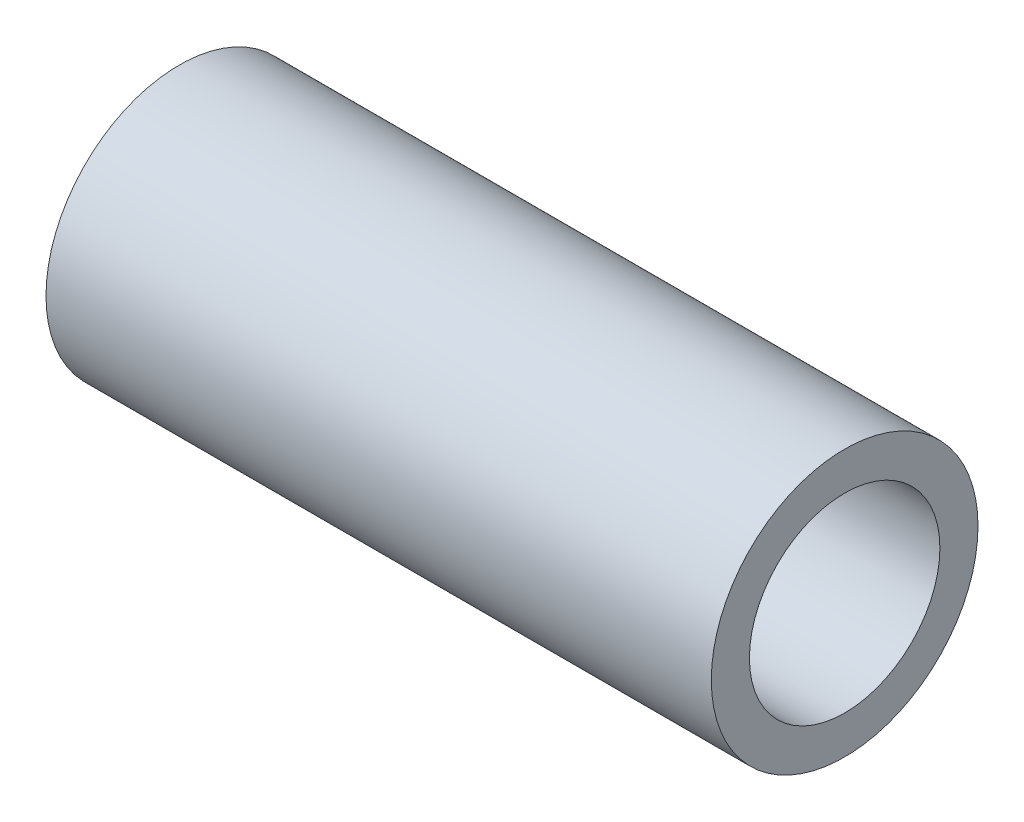
ISO-10303-21;
HEADER;
FILE_DESCRIPTION(('STEP AP214'),'2;1');
FILE_NAME('part.step','',(''),(''),'','','');
FILE_SCHEMA(('AUTOMOTIVE_DESIGN { 1 0 10303 214 1 1 1 1 }'));
ENDSEC;
DATA;
#1=APPLICATION_CONTEXT('core data for automotive mechanical design processes');
#2=APPLICATION_PROTOCOL_DEFINITION('international standard','automotive_design',2000,#1);
#3=PRODUCT_CONTEXT('',#1,'mechanical');
#4=PRODUCT('Part','Part','',(#3));
#5=PRODUCT_RELATED_PRODUCT_CATEGORY('part','',(#4));
#6=PRODUCT_DEFINITION_FORMATION('','',#4);
#7=PRODUCT_DEFINITION_CONTEXT('part definition',#1,'design');
#8=PRODUCT_DEFINITION('design','',#6,#7);
#9=PRODUCT_DEFINITION_SHAPE('','',#8);
#10=(LENGTH_UNIT() NAMED_UNIT(*) SI_UNIT(.MILLI.,.METRE.));
#11=(NAMED_UNIT(*) PLANE_ANGLE_UNIT() SI_UNIT($,.RADIAN.));
#12=(NAMED_UNIT(*) SI_UNIT($,.STERADIAN.) SOLID_ANGLE_UNIT());
#13=UNCERTAINTY_MEASURE_WITH_UNIT(LENGTH_MEASURE(1.E-05),#10,'distance_accuracy_value','');
#14=(GEOMETRIC_REPRESENTATION_CONTEXT(3) GLOBAL_UNCERTAINTY_ASSIGNED_CONTEXT((#13)) GLOBAL_UNIT_ASSIGNED_CONTEXT((#10,
#11,#12)) REPRESENTATION_CONTEXT('',''));
#15=CARTESIAN_POINT('',(0.,0.,0.));
#16=DIRECTION('',(0.,0.,1.));
#17=DIRECTION('',(1.,0.,0.));
#18=AXIS2_PLACEMENT_3D('',#15,#16,#17);
#19=CARTESIAN_POINT('',(17.4625,0.,0.));
#20=DIRECTION('',(1.,0.,0.));
#21=DIRECTION('',(0.,0.,-1.));
#22=AXIS2_PLACEMENT_3D('',#19,#20,#21);
#23=PLANE('',#22);
#24=CARTESIAN_POINT('',(17.4625,0.,0.));
#25=DIRECTION('',(1.,0.,0.));
#26=DIRECTION('',(0.,0.,-1.));
#27=AXIS2_PLACEMENT_3D('',#24,#25,#26);
#28=CIRCLE('',#27,3.5);
#29=CARTESIAN_POINT('',(17.4625,0.,-3.5));
#30=VERTEX_POINT('',#29);
#31=EDGE_CURVE('E10',#30,#30,#28,.T.);
#32=ORIENTED_EDGE('',*,*,#31,.T.);
#33=EDGE_LOOP('',(#32));
#34=FACE_BOUND('',#33,.T.);
#35=CARTESIAN_POINT('',(17.4625,0.,0.));
#36=DIRECTION('',(1.,0.,0.));
#37=DIRECTION('',(0.,0.,-1.));
#38=AXIS2_PLACEMENT_3D('',#35,#36,#37);
#39=CIRCLE('',#38,2.5);
#40=CARTESIAN_POINT('',(17.4625,0.,-2.5));
#41=VERTEX_POINT('',#40);
#42=EDGE_CURVE('E41',#41,#41,#39,.T.);
#43=ORIENTED_EDGE('',*,*,#42,.F.);
#44=EDGE_LOOP('',(#43));
#45=FACE_BOUND('',#44,.T.);
#46=ADVANCED_FACE('F30',(#34,#45),#23,.T.);
#47=CARTESIAN_POINT('',(0.,0.,0.));
#48=DIRECTION('',(1.,0.,0.));
#49=DIRECTION('',(0.,0.,-1.));
#50=AXIS2_PLACEMENT_3D('',#47,#48,#49);
#51=PLANE('',#50);
#52=CARTESIAN_POINT('',(0.,0.,0.));
#53=DIRECTION('',(1.,0.,0.));
#54=DIRECTION('',(0.,0.,-1.));
#55=AXIS2_PLACEMENT_3D('',#52,#53,#54);
#56=CIRCLE('',#55,3.5);
#57=CARTESIAN_POINT('',(0.,0.,-3.5));
#58=VERTEX_POINT('',#57);
#59=EDGE_CURVE('E34',#58,#58,#56,.T.);
#60=ORIENTED_EDGE('',*,*,#59,.F.);
#61=EDGE_LOOP('',(#60));
#62=FACE_BOUND('',#61,.T.);
#63=CARTESIAN_POINT('',(0.,0.,0.));
#64=DIRECTION('',(1.,0.,0.));
#65=DIRECTION('',(0.,0.,-1.));
#66=AXIS2_PLACEMENT_3D('',#63,#64,#65);
#67=CIRCLE('',#66,2.5);
#68=CARTESIAN_POINT('',(0.,0.,-2.5));
#69=VERTEX_POINT('',#68);
#70=EDGE_CURVE('E43',#69,#69,#67,.T.);
#71=ORIENTED_EDGE('',*,*,#70,.T.);
#72=EDGE_LOOP('',(#71));
#73=FACE_BOUND('',#72,.T.);
#74=ADVANCED_FACE('F53',(#62,#73),#51,.F.);
#75=CARTESIAN_POINT('',(17.4625,0.,0.));
#76=DIRECTION('',(-1.,0.,0.));
#77=DIRECTION('',(0.,0.,1.));
#78=AXIS2_PLACEMENT_3D('',#75,#76,#77);
#79=CYLINDRICAL_SURFACE('',#78,3.5);
#80=ORIENTED_EDGE('',*,*,#31,.F.);
#81=EDGE_LOOP('',(#80));
#82=FACE_BOUND('',#81,.T.);
#83=ORIENTED_EDGE('',*,*,#59,.T.);
#84=EDGE_LOOP('',(#83));
#85=FACE_BOUND('',#84,.T.);
#86=ADVANCED_FACE('F32',(#82,#85),#79,.T.);
#87=CARTESIAN_POINT('',(17.4625,0.,0.));
#88=DIRECTION('',(-1.,0.,0.));
#89=DIRECTION('',(0.,0.,1.));
#90=AXIS2_PLACEMENT_3D('',#87,#88,#89);
#91=CYLINDRICAL_SURFACE('',#90,2.5);
#92=ORIENTED_EDGE('',*,*,#42,.T.);
#93=EDGE_LOOP('',(#92));
#94=FACE_BOUND('',#93,.T.);
#95=ORIENTED_EDGE('',*,*,#70,.F.);
#96=EDGE_LOOP('',(#95));
#97=FACE_BOUND('',#96,.T.);
#98=ADVANCED_FACE('F49',(#94,#97),#91,.F.);
#99=CLOSED_SHELL('',(#46,#74,#86,#98));
#100=MANIFOLD_SOLID_BREP('B2',#99);
#101=ADVANCED_BREP_SHAPE_REPRESENTATION('',(#18,#100),#14);
#102=SHAPE_DEFINITION_REPRESENTATION(#9,#101);
ENDSEC;
END-ISO-10303-21;
